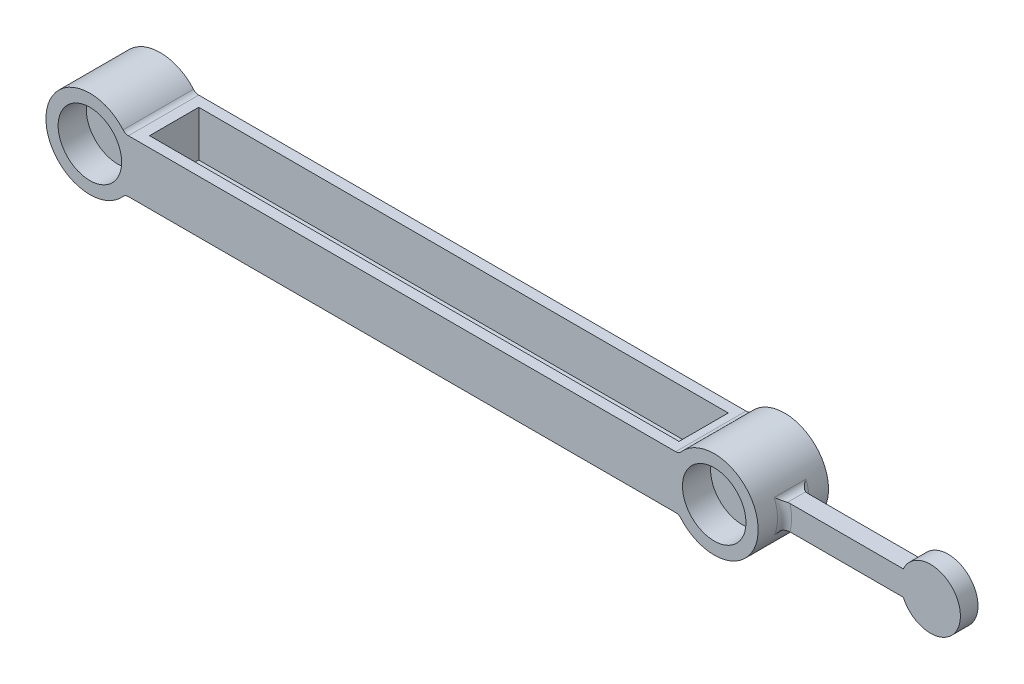
ISO-10303-21;
HEADER;
FILE_DESCRIPTION(('STEP AP214'),'2;1');
FILE_NAME('part.step','',(''),(''),'','','');
FILE_SCHEMA(('AUTOMOTIVE_DESIGN { 1 0 10303 214 1 1 1 1 }'));
ENDSEC;
DATA;
#1=APPLICATION_CONTEXT('core data for automotive mechanical design processes');
#2=APPLICATION_PROTOCOL_DEFINITION('international standard','automotive_design',2000,#1);
#3=PRODUCT_CONTEXT('',#1,'mechanical');
#4=PRODUCT('Part','Part','',(#3));
#5=PRODUCT_RELATED_PRODUCT_CATEGORY('part','',(#4));
#6=PRODUCT_DEFINITION_FORMATION('','',#4);
#7=PRODUCT_DEFINITION_CONTEXT('part definition',#1,'design');
#8=PRODUCT_DEFINITION('design','',#6,#7);
#9=PRODUCT_DEFINITION_SHAPE('','',#8);
#10=(LENGTH_UNIT() NAMED_UNIT(*) SI_UNIT(.MILLI.,.METRE.));
#11=(NAMED_UNIT(*) PLANE_ANGLE_UNIT() SI_UNIT($,.RADIAN.));
#12=(NAMED_UNIT(*) SI_UNIT($,.STERADIAN.) SOLID_ANGLE_UNIT());
#13=UNCERTAINTY_MEASURE_WITH_UNIT(LENGTH_MEASURE(1.E-05),#10,'distance_accuracy_value','');
#14=(GEOMETRIC_REPRESENTATION_CONTEXT(3) GLOBAL_UNCERTAINTY_ASSIGNED_CONTEXT((#13)) GLOBAL_UNIT_ASSIGNED_CONTEXT((#10,
#11,#12)) REPRESENTATION_CONTEXT('',''));
#15=CARTESIAN_POINT('',(0.,0.,0.));
#16=DIRECTION('',(0.,0.,1.));
#17=DIRECTION('',(1.,0.,0.));
#18=AXIS2_PLACEMENT_3D('',#15,#16,#17);
#19=CARTESIAN_POINT('',(187.5,-7.5,-35.3553390593273));
#20=DIRECTION('',(0.,0.,1.));
#21=DIRECTION('',(1.,0.,0.));
#22=AXIS2_PLACEMENT_3D('',#19,#20,#21);
#23=CYLINDRICAL_SURFACE('',#22,12.5);
#24=DIRECTION('',(0.,0.,1.));
#25=VECTOR('',#24,1.);
#26=CARTESIAN_POINT('',(178.056507629221,-15.6896551724138,-35.3553390593273));
#27=LINE('',#26,#25);
#28=CARTESIAN_POINT('',(178.056507629221,-15.6896551724138,20.));
#29=VERTEX_POINT('',#28);
#30=CARTESIAN_POINT('',(178.056507629221,-15.6896551724138,0.));
#31=VERTEX_POINT('',#30);
#32=EDGE_CURVE('E446',#29,#31,#27,.F.);
#33=ORIENTED_EDGE('',*,*,#32,.T.);
#34=CARTESIAN_POINT('',(187.5,-7.5,0.));
#35=DIRECTION('',(0.,0.,1.));
#36=DIRECTION('',(1.,0.,0.));
#37=AXIS2_PLACEMENT_3D('',#34,#35,#36);
#38=CIRCLE('',#37,12.5);
#39=CARTESIAN_POINT('',(178.056507629221,0.689655172413798,0.));
#40=VERTEX_POINT('',#39);
#41=EDGE_CURVE('E72',#40,#31,#38,.F.);
#42=ORIENTED_EDGE('',*,*,#41,.F.);
#43=DIRECTION('',(0.,0.,1.));
#44=VECTOR('',#43,1.);
#45=CARTESIAN_POINT('',(178.056507629221,0.689655172413793,-35.3553390593273));
#46=LINE('',#45,#44);
#47=CARTESIAN_POINT('',(178.056507629221,0.689655172413798,20.));
#48=VERTEX_POINT('',#47);
#49=EDGE_CURVE('E397',#40,#48,#46,.T.);
#50=ORIENTED_EDGE('',*,*,#49,.T.);
#51=CARTESIAN_POINT('',(187.5,-7.5,20.));
#52=DIRECTION('',(0.,0.,1.));
#53=DIRECTION('',(1.,0.,0.));
#54=AXIS2_PLACEMENT_3D('',#51,#52,#53);
#55=CIRCLE('',#54,12.5);
#56=EDGE_CURVE('E279',#29,#48,#55,.T.);
#57=ORIENTED_EDGE('',*,*,#56,.F.);
#58=EDGE_LOOP('',(#33,#42,#50,#57));
#59=FACE_BOUND('',#58,.T.);
#60=DIRECTION('',(0.,0.,1.));
#61=VECTOR('',#60,1.);
#62=CARTESIAN_POINT('',(199.065868849137,-2.75862068965515,-35.3553390593273));
#63=LINE('',#62,#61);
#64=CARTESIAN_POINT('',(199.065868849137,-2.75862068965515,14.5));
#65=VERTEX_POINT('',#64);
#66=CARTESIAN_POINT('',(199.065868849137,-2.75862068965515,5.5));
#67=VERTEX_POINT('',#66);
#68=EDGE_CURVE('E341',#65,#67,#63,.F.);
#69=ORIENTED_EDGE('',*,*,#68,.T.);
#70=CARTESIAN_POINT('',(187.5,-7.5,5.50000000000001));
#71=DIRECTION('',(0.,0.,-1.));
#72=DIRECTION('',(-1.,0.,0.));
#73=AXIS2_PLACEMENT_3D('',#70,#71,#72);
#74=CIRCLE('',#73,12.5);
#75=CARTESIAN_POINT('',(199.163765639202,-11.99517197822,5.49999999999999));
#76=VERTEX_POINT('',#75);
#77=EDGE_CURVE('E344',#67,#76,#74,.T.);
#78=ORIENTED_EDGE('',*,*,#77,.T.);
#79=DIRECTION('',(0.,0.,1.));
#80=VECTOR('',#79,1.);
#81=CARTESIAN_POINT('',(199.163765639202,-11.99517197822,-35.3553390593273));
#82=LINE('',#81,#80);
#83=CARTESIAN_POINT('',(199.163765639202,-11.99517197822,14.5));
#84=VERTEX_POINT('',#83);
#85=EDGE_CURVE('E335',#76,#84,#82,.T.);
#86=ORIENTED_EDGE('',*,*,#85,.T.);
#87=CARTESIAN_POINT('',(187.5,-7.5,14.5));
#88=DIRECTION('',(0.,0.,1.));
#89=DIRECTION('',(1.,0.,0.));
#90=AXIS2_PLACEMENT_3D('',#87,#88,#89);
#91=CIRCLE('',#90,12.5);
#92=EDGE_CURVE('E338',#84,#65,#91,.T.);
#93=ORIENTED_EDGE('',*,*,#92,.T.);
#94=EDGE_LOOP('',(#69,#78,#86,#93));
#95=FACE_BOUND('',#94,.T.);
#96=ADVANCED_FACE('F48',(#59,#95),#23,.T.);
#97=CARTESIAN_POINT('',(176.545548849897,2.,-35.3553390593273));
#98=DIRECTION('',(0.,0.,1.));
#99=DIRECTION('',(1.,0.,0.));
#100=AXIS2_PLACEMENT_3D('',#97,#98,#99);
#101=CYLINDRICAL_SURFACE('',#100,2.);
#102=CARTESIAN_POINT('',(176.545548849897,2.,0.));
#103=DIRECTION('',(0.,0.,1.));
#104=DIRECTION('',(1.,0.,0.));
#105=AXIS2_PLACEMENT_3D('',#102,#103,#104);
#106=CIRCLE('',#105,2.);
#107=CARTESIAN_POINT('',(176.545548849897,0.,0.));
#108=VERTEX_POINT('',#107);
#109=EDGE_CURVE('E440',#108,#40,#106,.T.);
#110=ORIENTED_EDGE('',*,*,#109,.F.);
#111=DIRECTION('',(0.,0.,-1.));
#112=VECTOR('',#111,1.);
#113=CARTESIAN_POINT('',(176.545548849897,0.,0.));
#114=LINE('',#113,#112);
#115=CARTESIAN_POINT('',(176.545548849897,0.,20.));
#116=VERTEX_POINT('',#115);
#117=EDGE_CURVE('E434',#116,#108,#114,.T.);
#118=ORIENTED_EDGE('',*,*,#117,.F.);
#119=CARTESIAN_POINT('',(176.545548849897,2.,20.));
#120=DIRECTION('',(0.,0.,1.));
#121=DIRECTION('',(1.,0.,0.));
#122=AXIS2_PLACEMENT_3D('',#119,#120,#121);
#123=CIRCLE('',#122,2.);
#124=EDGE_CURVE('E437',#48,#116,#123,.F.);
#125=ORIENTED_EDGE('',*,*,#124,.F.);
#126=ORIENTED_EDGE('',*,*,#49,.F.);
#127=EDGE_LOOP('',(#110,#118,#125,#126));
#128=FACE_BOUND('',#127,.T.);
#129=ADVANCED_FACE('F414',(#128),#101,.F.);
#130=CARTESIAN_POINT('',(187.5,-7.5,-29.));
#131=DIRECTION('',(0.,0.,1.));
#132=DIRECTION('',(1.,0.,0.));
#133=AXIS2_PLACEMENT_3D('',#130,#131,#132);
#134=CYLINDRICAL_SURFACE('',#133,9.025);
#135=CARTESIAN_POINT('',(187.5,-7.5,20.));
#136=DIRECTION('',(0.,0.,1.));
#137=DIRECTION('',(1.,0.,0.));
#138=AXIS2_PLACEMENT_3D('',#135,#136,#137);
#139=CIRCLE('',#138,9.025);
#140=CARTESIAN_POINT('',(196.525,-7.5,20.));
#141=VERTEX_POINT('',#140);
#142=EDGE_CURVE('E462',#141,#141,#139,.T.);
#143=ORIENTED_EDGE('',*,*,#142,.T.);
#144=EDGE_LOOP('',(#143));
#145=FACE_BOUND('',#144,.T.);
#146=CARTESIAN_POINT('',(187.5,-7.5,12.));
#147=DIRECTION('',(0.,0.,-1.));
#148=DIRECTION('',(-1.,0.,0.));
#149=AXIS2_PLACEMENT_3D('',#146,#147,#148);
#150=CIRCLE('',#149,9.025);
#151=CARTESIAN_POINT('',(178.475,-7.5,12.));
#152=VERTEX_POINT('',#151);
#153=EDGE_CURVE('E57',#152,#152,#150,.F.);
#154=ORIENTED_EDGE('',*,*,#153,.F.);
#155=EDGE_LOOP('',(#154));
#156=FACE_BOUND('',#155,.T.);
#157=ADVANCED_FACE('F475',(#145,#156),#134,.F.);
#158=CARTESIAN_POINT('',(187.5,-7.5,0.));
#159=DIRECTION('',(0.,0.,1.));
#160=DIRECTION('',(1.,0.,0.));
#161=AXIS2_PLACEMENT_3D('',#158,#159,#160);
#162=CIRCLE('',#161,9.025);
#163=CARTESIAN_POINT('',(196.525,-7.5,0.));
#164=VERTEX_POINT('',#163);
#165=EDGE_CURVE('E458',#164,#164,#162,.T.);
#166=ORIENTED_EDGE('',*,*,#165,.F.);
#167=EDGE_LOOP('',(#166));
#168=FACE_BOUND('',#167,.T.);
#169=CARTESIAN_POINT('',(187.5,-7.5,8.));
#170=DIRECTION('',(0.,0.,1.));
#171=DIRECTION('',(1.,0.,0.));
#172=AXIS2_PLACEMENT_3D('',#169,#170,#171);
#173=CIRCLE('',#172,9.025);
#174=CARTESIAN_POINT('',(196.525,-7.5,8.));
#175=VERTEX_POINT('',#174);
#176=EDGE_CURVE('E12',#175,#175,#173,.F.);
#177=ORIENTED_EDGE('',*,*,#176,.F.);
#178=EDGE_LOOP('',(#177));
#179=FACE_BOUND('',#178,.T.);
#180=ADVANCED_FACE('F477',(#168,#179),#134,.F.);
#181=CARTESIAN_POINT('',(10.,-7.5,20.));
#182=DIRECTION('',(0.,0.,-1.));
#183=DIRECTION('',(-1.,0.,0.));
#184=AXIS2_PLACEMENT_3D('',#181,#182,#183);
#185=CYLINDRICAL_SURFACE('',#184,12.5);
#186=DIRECTION('',(0.,0.,-1.));
#187=VECTOR('',#186,1.);
#188=CARTESIAN_POINT('',(19.4434923707787,0.689655172413792,20.));
#189=LINE('',#188,#187);
#190=CARTESIAN_POINT('',(19.4434923707787,0.689655172413794,20.));
#191=VERTEX_POINT('',#190);
#192=CARTESIAN_POINT('',(19.4434923707787,0.689655172413794,0.));
#193=VERTEX_POINT('',#192);
#194=EDGE_CURVE('E317',#191,#193,#189,.T.);
#195=ORIENTED_EDGE('',*,*,#194,.T.);
#196=CARTESIAN_POINT('',(10.,-7.5,0.));
#197=DIRECTION('',(0.,0.,-1.));
#198=DIRECTION('',(-1.,0.,0.));
#199=AXIS2_PLACEMENT_3D('',#196,#197,#198);
#200=CIRCLE('',#199,12.5);
#201=CARTESIAN_POINT('',(19.4434923707787,-15.6896551724138,0.));
#202=VERTEX_POINT('',#201);
#203=EDGE_CURVE('E284',#202,#193,#200,.T.);
#204=ORIENTED_EDGE('',*,*,#203,.F.);
#205=DIRECTION('',(0.,0.,-1.));
#206=VECTOR('',#205,1.);
#207=CARTESIAN_POINT('',(19.4434923707787,-15.6896551724138,20.));
#208=LINE('',#207,#206);
#209=CARTESIAN_POINT('',(19.4434923707787,-15.6896551724138,20.));
#210=VERTEX_POINT('',#209);
#211=EDGE_CURVE('E308',#202,#210,#208,.F.);
#212=ORIENTED_EDGE('',*,*,#211,.T.);
#213=CARTESIAN_POINT('',(10.,-7.5,20.));
#214=DIRECTION('',(0.,0.,-1.));
#215=DIRECTION('',(-1.,0.,0.));
#216=AXIS2_PLACEMENT_3D('',#213,#214,#215);
#217=CIRCLE('',#216,12.5);
#218=EDGE_CURVE('E285',#210,#191,#217,.T.);
#219=ORIENTED_EDGE('',*,*,#218,.T.);
#220=EDGE_LOOP('',(#195,#204,#212,#219));
#221=FACE_BOUND('',#220,.T.);
#222=ADVANCED_FACE('F484',(#221),#185,.T.);
#223=CARTESIAN_POINT('',(20.9544511501033,2.,20.));
#224=DIRECTION('',(0.,0.,-1.));
#225=DIRECTION('',(-1.,0.,0.));
#226=AXIS2_PLACEMENT_3D('',#223,#224,#225);
#227=CYLINDRICAL_SURFACE('',#226,2.);
#228=CARTESIAN_POINT('',(20.9544511501033,2.,20.));
#229=DIRECTION('',(0.,0.,1.));
#230=DIRECTION('',(1.,0.,0.));
#231=AXIS2_PLACEMENT_3D('',#228,#229,#230);
#232=CIRCLE('',#231,2.);
#233=CARTESIAN_POINT('',(20.9544511501033,0.,20.));
#234=VERTEX_POINT('',#233);
#235=EDGE_CURVE('E327',#234,#191,#232,.F.);
#236=ORIENTED_EDGE('',*,*,#235,.F.);
#237=DIRECTION('',(0.,0.,1.));
#238=VECTOR('',#237,1.);
#239=CARTESIAN_POINT('',(20.9544511501033,0.,20.));
#240=LINE('',#239,#238);
#241=CARTESIAN_POINT('',(20.9544511501033,0.,0.));
#242=VERTEX_POINT('',#241);
#243=EDGE_CURVE('E321',#242,#234,#240,.T.);
#244=ORIENTED_EDGE('',*,*,#243,.F.);
#245=CARTESIAN_POINT('',(20.9544511501033,2.,0.));
#246=DIRECTION('',(0.,0.,1.));
#247=DIRECTION('',(1.,0.,0.));
#248=AXIS2_PLACEMENT_3D('',#245,#246,#247);
#249=CIRCLE('',#248,2.);
#250=EDGE_CURVE('E324',#193,#242,#249,.T.);
#251=ORIENTED_EDGE('',*,*,#250,.F.);
#252=ORIENTED_EDGE('',*,*,#194,.F.);
#253=EDGE_LOOP('',(#236,#244,#251,#252));
#254=FACE_BOUND('',#253,.T.);
#255=ADVANCED_FACE('F502',(#254),#227,.F.);
#256=CARTESIAN_POINT('',(176.545548849897,-17.,-35.3553390593273));
#257=DIRECTION('',(0.,0.,1.));
#258=DIRECTION('',(1.,0.,0.));
#259=AXIS2_PLACEMENT_3D('',#256,#257,#258);
#260=CYLINDRICAL_SURFACE('',#259,2.);
#261=CARTESIAN_POINT('',(176.545548849897,-17.,20.));
#262=DIRECTION('',(0.,0.,1.));
#263=DIRECTION('',(1.,0.,0.));
#264=AXIS2_PLACEMENT_3D('',#261,#262,#263);
#265=CIRCLE('',#264,2.);
#266=CARTESIAN_POINT('',(176.545548849897,-15.,20.));
#267=VERTEX_POINT('',#266);
#268=EDGE_CURVE('E64',#267,#29,#265,.F.);
#269=ORIENTED_EDGE('',*,*,#268,.F.);
#270=DIRECTION('',(0.,0.,1.));
#271=VECTOR('',#270,1.);
#272=CARTESIAN_POINT('',(176.545548849897,-15.,20.));
#273=LINE('',#272,#271);
#274=CARTESIAN_POINT('',(176.545548849897,-15.,0.));
#275=VERTEX_POINT('',#274);
#276=EDGE_CURVE('E443',#275,#267,#273,.T.);
#277=ORIENTED_EDGE('',*,*,#276,.F.);
#278=CARTESIAN_POINT('',(176.545548849897,-17.,0.));
#279=DIRECTION('',(0.,0.,1.));
#280=DIRECTION('',(1.,0.,0.));
#281=AXIS2_PLACEMENT_3D('',#278,#279,#280);
#282=CIRCLE('',#281,2.);
#283=EDGE_CURVE('E451',#31,#275,#282,.T.);
#284=ORIENTED_EDGE('',*,*,#283,.F.);
#285=ORIENTED_EDGE('',*,*,#32,.F.);
#286=EDGE_LOOP('',(#269,#277,#284,#285));
#287=FACE_BOUND('',#286,.T.);
#288=ADVANCED_FACE('F50',(#287),#260,.F.);
#289=CARTESIAN_POINT('',(20.9544511501033,-17.,20.));
#290=DIRECTION('',(0.,0.,-1.));
#291=DIRECTION('',(-1.,0.,0.));
#292=AXIS2_PLACEMENT_3D('',#289,#290,#291);
#293=CYLINDRICAL_SURFACE('',#292,2.);
#294=CARTESIAN_POINT('',(20.9544511501033,-17.,20.));
#295=DIRECTION('',(0.,0.,1.));
#296=DIRECTION('',(1.,0.,0.));
#297=AXIS2_PLACEMENT_3D('',#294,#295,#296);
#298=CIRCLE('',#297,2.);
#299=CARTESIAN_POINT('',(20.9544511501033,-15.,20.));
#300=VERTEX_POINT('',#299);
#301=EDGE_CURVE('E314',#210,#300,#298,.F.);
#302=ORIENTED_EDGE('',*,*,#301,.F.);
#303=ORIENTED_EDGE('',*,*,#211,.F.);
#304=CARTESIAN_POINT('',(20.9544511501033,-17.,0.));
#305=DIRECTION('',(0.,0.,1.));
#306=DIRECTION('',(1.,0.,0.));
#307=AXIS2_PLACEMENT_3D('',#304,#305,#306);
#308=CIRCLE('',#307,2.);
#309=CARTESIAN_POINT('',(20.9544511501033,-15.,0.));
#310=VERTEX_POINT('',#309);
#311=EDGE_CURVE('E311',#310,#202,#308,.T.);
#312=ORIENTED_EDGE('',*,*,#311,.F.);
#313=DIRECTION('',(0.,0.,-1.));
#314=VECTOR('',#313,1.);
#315=CARTESIAN_POINT('',(20.9544511501033,-15.,20.));
#316=LINE('',#315,#314);
#317=EDGE_CURVE('E299',#300,#310,#316,.T.);
#318=ORIENTED_EDGE('',*,*,#317,.F.);
#319=EDGE_LOOP('',(#302,#303,#312,#318));
#320=FACE_BOUND('',#319,.T.);
#321=ADVANCED_FACE('F519',(#320),#293,.F.);
#322=CARTESIAN_POINT('',(10.,-7.5,-29.));
#323=DIRECTION('',(0.,0.,1.));
#324=DIRECTION('',(1.,0.,0.));
#325=AXIS2_PLACEMENT_3D('',#322,#323,#324);
#326=CYLINDRICAL_SURFACE('',#325,9.025);
#327=CARTESIAN_POINT('',(10.,-7.5,0.));
#328=DIRECTION('',(0.,0.,1.));
#329=DIRECTION('',(1.,0.,0.));
#330=AXIS2_PLACEMENT_3D('',#327,#328,#329);
#331=CIRCLE('',#330,9.025);
#332=CARTESIAN_POINT('',(19.025,-7.5,0.));
#333=VERTEX_POINT('',#332);
#334=EDGE_CURVE('E232',#333,#333,#331,.T.);
#335=ORIENTED_EDGE('',*,*,#334,.F.);
#336=EDGE_LOOP('',(#335));
#337=FACE_BOUND('',#336,.T.);
#338=CARTESIAN_POINT('',(10.,-7.5,8.));
#339=DIRECTION('',(0.,0.,1.));
#340=DIRECTION('',(1.,0.,0.));
#341=AXIS2_PLACEMENT_3D('',#338,#339,#340);
#342=CIRCLE('',#341,9.025);
#343=CARTESIAN_POINT('',(19.025,-7.5,8.));
#344=VERTEX_POINT('',#343);
#345=EDGE_CURVE('E466',#344,#344,#342,.F.);
#346=ORIENTED_EDGE('',*,*,#345,.F.);
#347=EDGE_LOOP('',(#346));
#348=FACE_BOUND('',#347,.T.);
#349=ADVANCED_FACE('F522',(#337,#348),#326,.F.);
#350=CARTESIAN_POINT('',(10.,-7.5,20.));
#351=DIRECTION('',(0.,0.,1.));
#352=DIRECTION('',(1.,0.,0.));
#353=AXIS2_PLACEMENT_3D('',#350,#351,#352);
#354=CIRCLE('',#353,9.025);
#355=CARTESIAN_POINT('',(19.025,-7.5,20.));
#356=VERTEX_POINT('',#355);
#357=EDGE_CURVE('E222',#356,#356,#354,.T.);
#358=ORIENTED_EDGE('',*,*,#357,.T.);
#359=EDGE_LOOP('',(#358));
#360=FACE_BOUND('',#359,.T.);
#361=CARTESIAN_POINT('',(10.,-7.5,12.));
#362=DIRECTION('',(0.,0.,-1.));
#363=DIRECTION('',(-1.,0.,0.));
#364=AXIS2_PLACEMENT_3D('',#361,#362,#363);
#365=CIRCLE('',#364,9.025);
#366=CARTESIAN_POINT('',(0.974999999999997,-7.5,12.));
#367=VERTEX_POINT('',#366);
#368=EDGE_CURVE('E454',#367,#367,#365,.F.);
#369=ORIENTED_EDGE('',*,*,#368,.F.);
#370=EDGE_LOOP('',(#369));
#371=FACE_BOUND('',#370,.T.);
#372=ADVANCED_FACE('F575',(#360,#371),#326,.F.);
#373=CARTESIAN_POINT('',(200.,-20.001,12.5));
#374=DIRECTION('',(0.,0.,1.));
#375=DIRECTION('',(1.,0.,0.));
#376=AXIS2_PLACEMENT_3D('',#373,#374,#375);
#377=PLANE('',#376);
#378=CARTESIAN_POINT('',(241.5,-7.49999999999998,12.5));
#379=DIRECTION('',(0.,0.,1.));
#380=DIRECTION('',(1.,0.,0.));
#381=AXIS2_PLACEMENT_3D('',#378,#379,#380);
#382=CIRCLE('',#381,8.50000000000001);
#383=CARTESIAN_POINT('',(233.754033307585,-3.99999999999998,12.5));
#384=VERTEX_POINT('',#383);
#385=CARTESIAN_POINT('',(233.754033307585,-11.,12.5));
#386=VERTEX_POINT('',#385);
#387=EDGE_CURVE('E250',#384,#386,#382,.F.);
#388=ORIENTED_EDGE('',*,*,#387,.F.);
#389=DIRECTION('',(1.,0.,0.));
#390=VECTOR('',#389,1.);
#391=CARTESIAN_POINT('',(200.,-3.99999999999998,12.5));
#392=LINE('',#391,#390);
#393=CARTESIAN_POINT('',(201.57124727947,-3.99999999999998,12.5));
#394=VERTEX_POINT('',#393);
#395=EDGE_CURVE('E272',#394,#384,#392,.T.);
#396=ORIENTED_EDGE('',*,*,#395,.F.);
#397=CARTESIAN_POINT('',(187.5,-7.5,12.5));
#398=DIRECTION('',(0.,0.,1.));
#399=DIRECTION('',(1.,0.,0.));
#400=AXIS2_PLACEMENT_3D('',#397,#398,#399);
#401=CIRCLE('',#400,14.5);
#402=CARTESIAN_POINT('',(201.57124727947,-11.,12.5));
#403=VERTEX_POINT('',#402);
#404=EDGE_CURVE('E351',#394,#403,#401,.F.);
#405=ORIENTED_EDGE('',*,*,#404,.T.);
#406=DIRECTION('',(-1.,0.,0.));
#407=VECTOR('',#406,1.);
#408=CARTESIAN_POINT('',(250.,-11.,12.5));
#409=LINE('',#408,#407);
#410=EDGE_CURVE('E269',#386,#403,#409,.T.);
#411=ORIENTED_EDGE('',*,*,#410,.F.);
#412=EDGE_LOOP('',(#388,#396,#405,#411));
#413=FACE_BOUND('',#412,.T.);
#414=ADVANCED_FACE('F385',(#413),#377,.T.);
#415=CARTESIAN_POINT('',(200.,-20.001,7.50000000000001));
#416=DIRECTION('',(0.,0.,-1.));
#417=DIRECTION('',(-1.,0.,0.));
#418=AXIS2_PLACEMENT_3D('',#415,#416,#417);
#419=PLANE('',#418);
#420=DIRECTION('',(-1.,0.,0.));
#421=VECTOR('',#420,1.);
#422=CARTESIAN_POINT('',(200.,-3.99999999999998,7.50000000000001));
#423=LINE('',#422,#421);
#424=CARTESIAN_POINT('',(233.754033307585,-3.99999999999998,7.50000000000001));
#425=VERTEX_POINT('',#424);
#426=CARTESIAN_POINT('',(201.57124727947,-3.99999999999998,7.50000000000001));
#427=VERTEX_POINT('',#426);
#428=EDGE_CURVE('E276',#425,#427,#423,.T.);
#429=ORIENTED_EDGE('',*,*,#428,.F.);
#430=CARTESIAN_POINT('',(241.5,-7.49999999999998,7.50000000000001));
#431=DIRECTION('',(0.,0.,-1.));
#432=DIRECTION('',(-1.,0.,0.));
#433=AXIS2_PLACEMENT_3D('',#430,#431,#432);
#434=CIRCLE('',#433,8.50000000000001);
#435=CARTESIAN_POINT('',(233.754033307585,-11.,7.50000000000001));
#436=VERTEX_POINT('',#435);
#437=EDGE_CURVE('E241',#425,#436,#434,.T.);
#438=ORIENTED_EDGE('',*,*,#437,.T.);
#439=DIRECTION('',(-1.,0.,0.));
#440=VECTOR('',#439,1.);
#441=CARTESIAN_POINT('',(250.,-11.,7.5));
#442=LINE('',#441,#440);
#443=CARTESIAN_POINT('',(201.57124727947,-11.,7.5));
#444=VERTEX_POINT('',#443);
#445=EDGE_CURVE('E265',#436,#444,#442,.T.);
#446=ORIENTED_EDGE('',*,*,#445,.T.);
#447=CARTESIAN_POINT('',(187.5,-7.5,7.50000000000001));
#448=DIRECTION('',(0.,0.,-1.));
#449=DIRECTION('',(-1.,0.,0.));
#450=AXIS2_PLACEMENT_3D('',#447,#448,#449);
#451=CIRCLE('',#450,14.5);
#452=EDGE_CURVE('E331',#444,#427,#451,.F.);
#453=ORIENTED_EDGE('',*,*,#452,.T.);
#454=EDGE_LOOP('',(#429,#438,#446,#453));
#455=FACE_BOUND('',#454,.T.);
#456=ADVANCED_FACE('F499',(#455),#419,.T.);
#457=CARTESIAN_POINT('',(0.,0.,20.));
#458=DIRECTION('',(0.,0.,1.));
#459=DIRECTION('',(1.,0.,0.));
#460=AXIS2_PLACEMENT_3D('',#457,#458,#459);
#461=PLANE('',#460);
#462=ORIENTED_EDGE('',*,*,#142,.F.);
#463=EDGE_LOOP('',(#462));
#464=FACE_BOUND('',#463,.T.);
#465=ORIENTED_EDGE('',*,*,#357,.F.);
#466=EDGE_LOOP('',(#465));
#467=FACE_BOUND('',#466,.T.);
#468=DIRECTION('',(1.,0.,0.));
#469=VECTOR('',#468,1.);
#470=CARTESIAN_POINT('',(0.,-15.,20.));
#471=LINE('',#470,#469);
#472=EDGE_CURVE('E291',#300,#267,#471,.T.);
#473=ORIENTED_EDGE('',*,*,#472,.T.);
#474=ORIENTED_EDGE('',*,*,#268,.T.);
#475=ORIENTED_EDGE('',*,*,#56,.T.);
#476=ORIENTED_EDGE('',*,*,#124,.T.);
#477=DIRECTION('',(1.,0.,0.));
#478=VECTOR('',#477,1.);
#479=CARTESIAN_POINT('',(0.,0.,20.));
#480=LINE('',#479,#478);
#481=EDGE_CURVE('E294',#234,#116,#480,.T.);
#482=ORIENTED_EDGE('',*,*,#481,.F.);
#483=ORIENTED_EDGE('',*,*,#235,.T.);
#484=ORIENTED_EDGE('',*,*,#218,.F.);
#485=ORIENTED_EDGE('',*,*,#301,.T.);
#486=EDGE_LOOP('',(#473,#474,#475,#476,#482,#483,#484,#485));
#487=FACE_BOUND('',#486,.T.);
#488=ADVANCED_FACE('F504',(#464,#467,#487),#461,.T.);
#489=CARTESIAN_POINT('',(0.,0.,0.));
#490=DIRECTION('',(0.,0.,1.));
#491=DIRECTION('',(1.,0.,0.));
#492=AXIS2_PLACEMENT_3D('',#489,#490,#491);
#493=PLANE('',#492);
#494=ORIENTED_EDGE('',*,*,#165,.T.);
#495=EDGE_LOOP('',(#494));
#496=FACE_BOUND('',#495,.T.);
#497=ORIENTED_EDGE('',*,*,#334,.T.);
#498=EDGE_LOOP('',(#497));
#499=FACE_BOUND('',#498,.T.);
#500=DIRECTION('',(1.,0.,0.));
#501=VECTOR('',#500,1.);
#502=CARTESIAN_POINT('',(0.,0.,0.));
#503=LINE('',#502,#501);
#504=EDGE_CURVE('E295',#242,#108,#503,.T.);
#505=ORIENTED_EDGE('',*,*,#504,.T.);
#506=ORIENTED_EDGE('',*,*,#109,.T.);
#507=ORIENTED_EDGE('',*,*,#41,.T.);
#508=ORIENTED_EDGE('',*,*,#283,.T.);
#509=DIRECTION('',(1.,0.,0.));
#510=VECTOR('',#509,1.);
#511=CARTESIAN_POINT('',(0.,-15.,0.));
#512=LINE('',#511,#510);
#513=EDGE_CURVE('E288',#310,#275,#512,.T.);
#514=ORIENTED_EDGE('',*,*,#513,.F.);
#515=ORIENTED_EDGE('',*,*,#311,.T.);
#516=ORIENTED_EDGE('',*,*,#203,.T.);
#517=ORIENTED_EDGE('',*,*,#250,.T.);
#518=EDGE_LOOP('',(#505,#506,#507,#508,#514,#515,#516,#517));
#519=FACE_BOUND('',#518,.T.);
#520=ADVANCED_FACE('F507',(#496,#499,#519),#493,.F.);
#521=CARTESIAN_POINT('',(0.,-15.,20.));
#522=DIRECTION('',(0.,1.,0.));
#523=DIRECTION('',(0.,0.,1.));
#524=AXIS2_PLACEMENT_3D('',#521,#522,#523);
#525=PLANE('',#524);
#526=ORIENTED_EDGE('',*,*,#513,.T.);
#527=ORIENTED_EDGE('',*,*,#276,.T.);
#528=ORIENTED_EDGE('',*,*,#472,.F.);
#529=ORIENTED_EDGE('',*,*,#317,.T.);
#530=EDGE_LOOP('',(#526,#527,#528,#529));
#531=FACE_BOUND('',#530,.T.);
#532=ADVANCED_FACE('F511',(#531),#525,.F.);
#533=CARTESIAN_POINT('',(0.,0.,20.));
#534=DIRECTION('',(0.,1.,0.));
#535=DIRECTION('',(0.,0.,1.));
#536=AXIS2_PLACEMENT_3D('',#533,#534,#535);
#537=PLANE('',#536);
#538=DIRECTION('',(0.,0.,1.));
#539=VECTOR('',#538,1.);
#540=CARTESIAN_POINT('',(23.9544511501033,0.,3.));
#541=LINE('',#540,#539);
#542=CARTESIAN_POINT('',(23.9544511501033,0.,3.));
#543=VERTEX_POINT('',#542);
#544=CARTESIAN_POINT('',(23.9544511501033,0.,17.));
#545=VERTEX_POINT('',#544);
#546=EDGE_CURVE('E195',#543,#545,#541,.T.);
#547=ORIENTED_EDGE('',*,*,#546,.F.);
#548=DIRECTION('',(-1.,0.,0.));
#549=VECTOR('',#548,1.);
#550=CARTESIAN_POINT('',(23.9544511501033,0.,3.));
#551=LINE('',#550,#549);
#552=CARTESIAN_POINT('',(174.5,0.,3.));
#553=VERTEX_POINT('',#552);
#554=EDGE_CURVE('E215',#553,#543,#551,.T.);
#555=ORIENTED_EDGE('',*,*,#554,.F.);
#556=DIRECTION('',(0.,0.,-1.));
#557=VECTOR('',#556,1.);
#558=CARTESIAN_POINT('',(174.5,0.,3.));
#559=LINE('',#558,#557);
#560=CARTESIAN_POINT('',(174.5,0.,17.));
#561=VERTEX_POINT('',#560);
#562=EDGE_CURVE('E219',#561,#553,#559,.T.);
#563=ORIENTED_EDGE('',*,*,#562,.F.);
#564=DIRECTION('',(1.,0.,0.));
#565=VECTOR('',#564,1.);
#566=CARTESIAN_POINT('',(23.9544511501033,0.,17.));
#567=LINE('',#566,#565);
#568=EDGE_CURVE('E231',#545,#561,#567,.T.);
#569=ORIENTED_EDGE('',*,*,#568,.F.);
#570=EDGE_LOOP('',(#547,#555,#563,#569));
#571=FACE_BOUND('',#570,.T.);
#572=ORIENTED_EDGE('',*,*,#481,.T.);
#573=ORIENTED_EDGE('',*,*,#117,.T.);
#574=ORIENTED_EDGE('',*,*,#504,.F.);
#575=ORIENTED_EDGE('',*,*,#243,.T.);
#576=EDGE_LOOP('',(#572,#573,#574,#575));
#577=FACE_BOUND('',#576,.T.);
#578=ADVANCED_FACE('F381',(#571,#577),#537,.T.);
#579=CARTESIAN_POINT('',(0.,-3.99999999999998,0.));
#580=DIRECTION('',(0.,1.,0.));
#581=DIRECTION('',(0.,0.,1.));
#582=AXIS2_PLACEMENT_3D('',#579,#580,#581);
#583=PLANE('',#582);
#584=DIRECTION('',(0.,0.,-1.));
#585=VECTOR('',#584,1.);
#586=CARTESIAN_POINT('',(233.754033307585,-3.99999999999998,36.5416305603426));
#587=LINE('',#586,#585);
#588=EDGE_CURVE('E257',#425,#384,#587,.F.);
#589=ORIENTED_EDGE('',*,*,#588,.F.);
#590=ORIENTED_EDGE('',*,*,#428,.T.);
#591=CARTESIAN_POINT('',(201.57124727947,-3.99999999999998,7.50000000000001));
#592=CARTESIAN_POINT('',(201.515605478267,-3.99999999999998,7.50000359986055));
#593=CARTESIAN_POINT('',(201.459964742336,-3.99999999999998,7.49781329007921));
#594=CARTESIAN_POINT('',(201.349363147591,-3.99999999999998,7.48910786881818));
#595=CARTESIAN_POINT('',(201.294400211957,-3.99999999999998,7.48261913950181));
#596=CARTESIAN_POINT('',(201.185147898397,-3.99999999999998,7.46537904372189));
#597=CARTESIAN_POINT('',(201.130858508989,-3.99999999999998,7.45462775002152));
#598=CARTESIAN_POINT('',(201.022952882588,-3.99999999999998,7.42885085870193));
#599=CARTESIAN_POINT('',(200.969342796758,-3.99999999999998,7.41379951092649));
#600=CARTESIAN_POINT('',(200.916407864999,-3.99999999999998,7.39665866512649));
#601=B_SPLINE_CURVE_WITH_KNOTS('',3,(#591,#592,#593,#594,#595,#596,#597,#598,#599,#600),
.UNSPECIFIED.,.F.,.F.,(4,2,2,2,4),(0.,0.166880700383961,0.332746520621892,0.498609509604915,
0.665487343841117),.UNSPECIFIED.);
#602=CARTESIAN_POINT('',(200.916407864999,-3.99999999999998,7.39665866512649));
#603=VERTEX_POINT('',#602);
#604=EDGE_CURVE('E355',#427,#603,#601,.T.);
#605=ORIENTED_EDGE('',*,*,#604,.T.);
#606=DIRECTION('',(0.,0.,-1.));
#607=VECTOR('',#606,1.);
#608=CARTESIAN_POINT('',(200.916407864999,-3.99999999999998,12.5));
#609=LINE('',#608,#607);
#610=CARTESIAN_POINT('',(200.916407864999,-3.99999999999998,12.6033413348735));
#611=VERTEX_POINT('',#610);
#612=EDGE_CURVE('E348',#603,#611,#609,.F.);
#613=ORIENTED_EDGE('',*,*,#612,.T.);
#614=CARTESIAN_POINT('',(200.916407864999,-3.99999999999998,12.6033413348735));
#615=CARTESIAN_POINT('',(200.969342796758,-3.99999999999998,12.5862004890735));
#616=CARTESIAN_POINT('',(201.022952882588,-3.99999999999998,12.5711491412981));
#617=CARTESIAN_POINT('',(201.130858508989,-3.99999999999998,12.5453722499785));
#618=CARTESIAN_POINT('',(201.185147898397,-3.99999999999998,12.5346209562781));
#619=CARTESIAN_POINT('',(201.294400211957,-3.99999999999998,12.5173808604982));
#620=CARTESIAN_POINT('',(201.349363147591,-3.99999999999998,12.5108921311818));
#621=CARTESIAN_POINT('',(201.459964742336,-3.99999999999998,12.5021867099208));
#622=CARTESIAN_POINT('',(201.515605478267,-3.99999999999998,12.4999964001395));
#623=CARTESIAN_POINT('',(201.57124727947,-3.99999999999998,12.5));
#624=B_SPLINE_CURVE_WITH_KNOTS('',3,(#614,#615,#616,#617,#618,#619,#620,#621,#622,#623),
.UNSPECIFIED.,.F.,.F.,(4,2,2,2,4),(0.,0.166877834236202,0.332740823219225,0.498606643457156,
0.665487343841117),.UNSPECIFIED.);
#625=EDGE_CURVE('E389',#611,#394,#624,.T.);
#626=ORIENTED_EDGE('',*,*,#625,.T.);
#627=ORIENTED_EDGE('',*,*,#395,.T.);
#628=EDGE_LOOP('',(#589,#590,#605,#613,#626,#627));
#629=FACE_BOUND('',#628,.T.);
#630=ADVANCED_FACE('F376',(#629),#583,.T.);
#631=CARTESIAN_POINT('',(250.,-11.,12.5));
#632=DIRECTION('',(0.,1.,0.));
#633=DIRECTION('',(-1.,0.,0.));
#634=AXIS2_PLACEMENT_3D('',#631,#632,#633);
#635=PLANE('',#634);
#636=ORIENTED_EDGE('',*,*,#445,.F.);
#637=DIRECTION('',(0.,0.,-1.));
#638=VECTOR('',#637,1.);
#639=CARTESIAN_POINT('',(233.754033307585,-11.,36.5416305603426));
#640=LINE('',#639,#638);
#641=EDGE_CURVE('E253',#436,#386,#640,.F.);
#642=ORIENTED_EDGE('',*,*,#641,.T.);
#643=ORIENTED_EDGE('',*,*,#410,.T.);
#644=CARTESIAN_POINT('',(201.57124727947,-11.,12.5));
#645=CARTESIAN_POINT('',(201.51162382029,-11.,12.5000016456297));
#646=CARTESIAN_POINT('',(201.452029989283,-11.,12.5025124577496));
#647=CARTESIAN_POINT('',(201.333262944996,-11.,12.512524431705));
#648=CARTESIAN_POINT('',(201.274089732418,-11.,12.5200256018678));
#649=CARTESIAN_POINT('',(201.097716265368,-11.,12.5499772638655));
#650=CARTESIAN_POINT('',(200.981690002942,-11.,12.5798758811724));
#651=CARTESIAN_POINT('',(200.756284563965,-11.,12.6587515729556));
#652=CARTESIAN_POINT('',(200.646910918206,-11.,12.7077442776903));
#653=CARTESIAN_POINT('',(200.438199834693,-11.,12.8235375981562));
#654=CARTESIAN_POINT('',(200.338843041622,-11.,12.8903029263211));
#655=CARTESIAN_POINT('',(200.201873349749,-11.,13.0006149997572));
#656=CARTESIAN_POINT('',(200.159179790318,-11.,13.0380047874333));
#657=CARTESIAN_POINT('',(200.077075730124,-11.,13.1161558099637));
#658=CARTESIAN_POINT('',(200.037662195178,-11.,13.1569138578436));
#659=CARTESIAN_POINT('',(200.,-11.,13.1992715169306));
#660=B_SPLINE_CURVE_WITH_KNOTS('',3,(#644,#645,#646,#647,#648,#649,#650,#651,#652,#653,#654,
#655,#656,#657,#658,#659),.UNSPECIFIED.,.F.,.F.,(4,2,2,2,2,2,2,4),(0.,0.178758942197527,
0.357518182685035,0.71511907625985,1.07301331583531,1.43020218871193,1.60029028662042,
1.77021925408653),.UNSPECIFIED.);
#661=CARTESIAN_POINT('',(200.,-11.,13.1992715169306));
#662=VERTEX_POINT('',#661);
#663=EDGE_CURVE('E398',#403,#662,#660,.T.);
#664=ORIENTED_EDGE('',*,*,#663,.T.);
#665=DIRECTION('',(0.,0.,-1.));
#666=VECTOR('',#665,1.);
#667=CARTESIAN_POINT('',(200.,-11.,12.5));
#668=LINE('',#667,#666);
#669=CARTESIAN_POINT('',(200.,-11.,6.80072848306937));
#670=VERTEX_POINT('',#669);
#671=EDGE_CURVE('E262',#662,#670,#668,.T.);
#672=ORIENTED_EDGE('',*,*,#671,.T.);
#673=CARTESIAN_POINT('',(200.,-11.,6.80072848306937));
#674=CARTESIAN_POINT('',(200.038907567059,-11.,6.8444878824641));
#675=CARTESIAN_POINT('',(200.079686314274,-11.,6.88654030735841));
#676=CARTESIAN_POINT('',(200.164681235809,-11.,6.96699896735284));
#677=CARTESIAN_POINT('',(200.20889677045,-11.,7.00540587804037));
#678=CARTESIAN_POINT('',(200.346113701294,-11.,7.11471376628746));
#679=CARTESIAN_POINT('',(200.443815182844,-11.,7.17984707714963));
#680=CARTESIAN_POINT('',(200.648600179143,-11.,7.29291300846766));
#681=CARTESIAN_POINT('',(200.755682808273,-11.,7.34084725041487));
#682=CARTESIAN_POINT('',(200.976233676181,-11.,7.41839971965647));
#683=CARTESIAN_POINT('',(201.089695563287,-11.,7.44803582555481));
#684=CARTESIAN_POINT('',(201.26525542627,-11.,7.47876188612817));
#685=CARTESIAN_POINT('',(201.326228447063,-11.,7.48672402431916));
#686=CARTESIAN_POINT('',(201.44854082522,-11.,7.49733857987544));
#687=CARTESIAN_POINT('',(201.509879478549,-11.,7.49999911019276));
#688=CARTESIAN_POINT('',(201.57124727947,-11.,7.50000000000001));
#689=B_SPLINE_CURVE_WITH_KNOTS('',3,(#673,#674,#675,#676,#677,#678,#679,#680,#681,#682,#683,
#684,#685,#686,#687,#688),.UNSPECIFIED.,.F.,.F.,(4,2,2,2,2,2,2,4),(0.,0.17554815106669,
0.351063705737492,0.701518241773535,1.05193972902048,1.4020182850192,1.58628873669285,
1.7702769855007),.UNSPECIFIED.);
#690=EDGE_CURVE('E365',#670,#444,#689,.T.);
#691=ORIENTED_EDGE('',*,*,#690,.T.);
#692=EDGE_LOOP('',(#636,#642,#643,#664,#672,#691));
#693=FACE_BOUND('',#692,.T.);
#694=ADVANCED_FACE('F380',(#693),#635,.F.);
#695=CARTESIAN_POINT('',(187.5,-7.5,14.5));
#696=DIRECTION('',(0.,0.,1.));
#697=DIRECTION('',(1.,0.,0.));
#698=AXIS2_PLACEMENT_3D('',#695,#696,#697);
#699=TOROIDAL_SURFACE('',#698,14.5,2.);
#700=CARTESIAN_POINT('',(200.916407864999,-3.99999999999998,12.6033413348735));
#701=CARTESIAN_POINT('',(200.862186883756,-4.00000390121646,12.6208885368897));
#702=CARTESIAN_POINT('',(200.808686295791,-3.99779540526467,12.6404426257832));
#703=CARTESIAN_POINT('',(200.70356489637,-3.98933870418249,12.6830845423605));
#704=CARTESIAN_POINT('',(200.65194037839,-3.98309897978155,12.706164874032));
#705=CARTESIAN_POINT('',(200.501501436883,-3.95910078698158,12.7794680464116));
#706=CARTESIAN_POINT('',(200.405713142822,-3.93604270785565,12.8342272080231));
#707=CARTESIAN_POINT('',(200.198325531016,-3.87064017908624,12.9691740155557));
#708=CARTESIAN_POINT('',(200.089764238342,-3.82471088380596,13.052194646803));
#709=CARTESIAN_POINT('',(199.887718282399,-3.71897918702722,13.2283264972153));
#710=CARTESIAN_POINT('',(199.794337086407,-3.6590878406703,13.3215002794785));
#711=CARTESIAN_POINT('',(199.646745537588,-3.54723945128378,13.4870041689755));
#712=CARTESIAN_POINT('',(199.588896160285,-3.49777131748866,13.557847277867));
#713=CARTESIAN_POINT('',(199.480590914056,-3.39428932207958,13.7018938331797));
#714=CARTESIAN_POINT('',(199.4301387045,-3.34027323125873,13.7750984261238));
#715=CARTESIAN_POINT('',(199.336496491789,-3.22848852541345,13.9229197508665));
#716=CARTESIAN_POINT('',(199.293290736994,-3.1707284381349,13.9975330169747));
#717=CARTESIAN_POINT('',(199.213834572629,-3.05183387339349,14.1476960071141));
#718=CARTESIAN_POINT('',(199.177581233542,-2.99070083122592,14.2232453223759));
#719=CARTESIAN_POINT('',(199.116726557607,-2.87452540064189,14.3637212272183));
#720=CARTESIAN_POINT('',(199.091196791537,-2.81989703297147,14.4285881852315));
#721=CARTESIAN_POINT('',(199.067410641857,-2.76237351327038,14.4956302715592));
#722=CARTESIAN_POINT('',(199.066638315924,-2.76049767869423,14.4978151445727));
#723=CARTESIAN_POINT('',(199.065868849137,-2.75862068965516,14.5));
#724=B_SPLINE_CURVE_WITH_KNOTS('',3,(#700,#701,#702,#703,#704,#705,#706,#707,#708,#709,#710,
#711,#712,#713,#714,#715,#716,#717,#718,#719,#720,#721,#722,#723),.UNSPECIFIED.,.F.,.F.,(4,2,2,
2,2,2,2,2,2,2,2,4),(0.,0.170778533186009,0.341198954432175,0.677654053997893,1.10791791783455,
1.54100151735702,1.85256779378011,2.16428768528113,2.47532095287399,2.78622287206828,
3.05172929734904,3.0606735740518),.UNSPECIFIED.);
#725=EDGE_CURVE('E418',#65,#611,#724,.F.);
#726=ORIENTED_EDGE('',*,*,#725,.F.);
#727=ORIENTED_EDGE('',*,*,#92,.F.);
#728=CARTESIAN_POINT('',(200.,-11.,13.1992715169306));
#729=CARTESIAN_POINT('',(199.943224365213,-11.034134871955,13.252410015321));
#730=CARTESIAN_POINT('',(199.889211473703,-11.0703976826139,13.3070355765156));
#731=CARTESIAN_POINT('',(199.786567134142,-11.146580617138,13.4186149677985));
#732=CARTESIAN_POINT('',(199.737929970857,-11.186496772734,13.4755662353077));
#733=CARTESIAN_POINT('',(199.645897958607,-11.2693501253518,13.5911096573184));
#734=CARTESIAN_POINT('',(199.602489142727,-11.3122787657981,13.6496969007307));
#735=CARTESIAN_POINT('',(199.520574456136,-11.4008658204407,13.7682284908815));
#736=CARTESIAN_POINT('',(199.482069685073,-11.4465248435173,13.8281731384581));
#737=CARTESIAN_POINT('',(199.386684734066,-11.5702623028953,13.9877356980767));
#738=CARTESIAN_POINT('',(199.333819766843,-11.6503839271457,14.0881864719828));
#739=CARTESIAN_POINT('',(199.240553602801,-11.816056483818,14.290256993324));
#740=CARTESIAN_POINT('',(199.200143673653,-11.901603561438,14.391875869705));
#741=CARTESIAN_POINT('',(199.165227543339,-11.9913873307303,14.4956302832869));
#742=CARTESIAN_POINT('',(199.164495149946,-11.9932791136459,14.4978151563906));
#743=CARTESIAN_POINT('',(199.163765639202,-11.99517197822,14.5));
#744=B_SPLINE_CURVE_WITH_KNOTS('',3,(#728,#729,#730,#731,#732,#733,#734,#735,#736,#737,#738,
#739,#740,#741,#742,#743),.UNSPECIFIED.,.F.,.F.,(4,2,2,2,2,2,2,4),(0.,0.254603188791481,
0.508933036922161,0.762567650512276,1.01625903755188,1.43234508102664,1.84813873604255,
1.85708301274525),.UNSPECIFIED.);
#745=EDGE_CURVE('E266',#662,#84,#744,.T.);
#746=ORIENTED_EDGE('',*,*,#745,.F.);
#747=ORIENTED_EDGE('',*,*,#663,.F.);
#748=ORIENTED_EDGE('',*,*,#404,.F.);
#749=ORIENTED_EDGE('',*,*,#625,.F.);
#750=EDGE_LOOP('',(#726,#727,#746,#747,#748,#749));
#751=FACE_BOUND('',#750,.T.);
#752=ADVANCED_FACE('F408',(#751),#699,.F.);
#753=CARTESIAN_POINT('',(201.029968141474,-12.7143994947352,-35.3553390593273));
#754=DIRECTION('',(0.,0.,1.));
#755=DIRECTION('',(1.,0.,0.));
#756=AXIS2_PLACEMENT_3D('',#753,#754,#755);
#757=CYLINDRICAL_SURFACE('',#756,2.);
#758=ORIENTED_EDGE('',*,*,#745,.T.);
#759=ORIENTED_EDGE('',*,*,#85,.F.);
#760=CARTESIAN_POINT('',(200.,-11.,6.80072848306937));
#761=CARTESIAN_POINT('',(199.943224365213,-11.034134871955,6.74758998467903));
#762=CARTESIAN_POINT('',(199.889211473703,-11.0703976826139,6.69296442348444));
#763=CARTESIAN_POINT('',(199.786567134142,-11.146580617138,6.58138503220149));
#764=CARTESIAN_POINT('',(199.737929970857,-11.186496772734,6.52443376469226));
#765=CARTESIAN_POINT('',(199.645897958607,-11.2693501253518,6.40889034268157));
#766=CARTESIAN_POINT('',(199.602489142727,-11.3122787657981,6.35030309926931));
#767=CARTESIAN_POINT('',(199.520574456137,-11.4008658204407,6.23177150911847));
#768=CARTESIAN_POINT('',(199.482069685073,-11.4465248435174,6.17182686154201));
#769=CARTESIAN_POINT('',(199.386684734066,-11.5702623028952,6.01226430192324));
#770=CARTESIAN_POINT('',(199.333819766843,-11.6503839271453,5.91181352801679));
#771=CARTESIAN_POINT('',(199.240553602801,-11.8160564838184,5.70974300667643));
#772=CARTESIAN_POINT('',(199.200143673653,-11.9016035614397,5.60812413029664));
#773=CARTESIAN_POINT('',(199.165227543339,-11.9913873307304,5.50436971671313));
#774=CARTESIAN_POINT('',(199.164495149946,-11.9932791136459,5.50218484360941));
#775=CARTESIAN_POINT('',(199.163765639202,-11.99517197822,5.50000000000001));
#776=B_SPLINE_CURVE_WITH_KNOTS('',3,(#760,#761,#762,#763,#764,#765,#766,#767,#768,#769,#770,
#771,#772,#773,#774,#775),.UNSPECIFIED.,.F.,.F.,(4,2,2,2,2,2,2,4),(0.,0.254603188791493,
0.508933036922163,0.762567650512251,1.01625903755188,1.43234508102663,1.84813873604254,
1.85708301274525),.UNSPECIFIED.);
#777=EDGE_CURVE('E549',#670,#76,#776,.T.);
#778=ORIENTED_EDGE('',*,*,#777,.F.);
#779=ORIENTED_EDGE('',*,*,#671,.F.);
#780=EDGE_LOOP('',(#758,#759,#778,#779));
#781=FACE_BOUND('',#780,.T.);
#782=ADVANCED_FACE('F411',(#781),#757,.F.);
#783=CARTESIAN_POINT('',(200.916407864999,-1.99999999999998,-35.3553390593273));
#784=DIRECTION('',(0.,0.,1.));
#785=DIRECTION('',(1.,0.,0.));
#786=AXIS2_PLACEMENT_3D('',#783,#784,#785);
#787=CYLINDRICAL_SURFACE('',#786,2.);
#788=ORIENTED_EDGE('',*,*,#612,.F.);
#789=CARTESIAN_POINT('',(200.916407864999,-3.99999999999998,7.39665866512649));
#790=CARTESIAN_POINT('',(200.862186883756,-4.00000390121646,7.37911146311029));
#791=CARTESIAN_POINT('',(200.808686295791,-3.99779540526467,7.35955737421677));
#792=CARTESIAN_POINT('',(200.70356489637,-3.98933870418249,7.3169154576395));
#793=CARTESIAN_POINT('',(200.65194037839,-3.98309897978155,7.29383512596795));
#794=CARTESIAN_POINT('',(200.501501436883,-3.95910078698158,7.22053195358838));
#795=CARTESIAN_POINT('',(200.405713142822,-3.93604270785565,7.16577279197689));
#796=CARTESIAN_POINT('',(200.198325531016,-3.87064017908624,7.03082598444431));
#797=CARTESIAN_POINT('',(200.089764238342,-3.82471088380596,6.94780535319697));
#798=CARTESIAN_POINT('',(199.887718282399,-3.71897918702721,6.77167350278467));
#799=CARTESIAN_POINT('',(199.794337086407,-3.65908784067029,6.67849972052152));
#800=CARTESIAN_POINT('',(199.646745537588,-3.54723945128378,6.51299583102451));
#801=CARTESIAN_POINT('',(199.588896160285,-3.49777131748868,6.44215272213299));
#802=CARTESIAN_POINT('',(199.480590914056,-3.39428932207954,6.29810616682033));
#803=CARTESIAN_POINT('',(199.4301387045,-3.34027323125863,6.22490157387627));
#804=CARTESIAN_POINT('',(199.336496491789,-3.22848852541351,6.0770802491334));
#805=CARTESIAN_POINT('',(199.293290736994,-3.1707284381352,6.00246698302495));
#806=CARTESIAN_POINT('',(199.213834572629,-3.05183387339317,5.85230399288618));
#807=CARTESIAN_POINT('',(199.177581233541,-2.99070083122474,5.77675467762531));
#808=CARTESIAN_POINT('',(199.116726557607,-2.8745254006429,5.63627877278071));
#809=CARTESIAN_POINT('',(199.091196791539,-2.81989703297497,5.57141181476503));
#810=CARTESIAN_POINT('',(199.067410641857,-2.76237351327061,5.50436972844063));
#811=CARTESIAN_POINT('',(199.066638315924,-2.76049767869435,5.50218485542726));
#812=CARTESIAN_POINT('',(199.065868849137,-2.75862068965516,5.50000000000002));
#813=B_SPLINE_CURVE_WITH_KNOTS('',3,(#789,#790,#791,#792,#793,#794,#795,#796,#797,#798,#799,
#800,#801,#802,#803,#804,#805,#806,#807,#808,#809,#810,#811,#812),.UNSPECIFIED.,.F.,.F.,(4,2,2,
2,2,2,2,2,2,2,2,4),(0.,0.170778533186009,0.341198954432176,0.677654053997893,1.10791791783454,
1.54100151735702,1.85256779378014,2.16428768528118,2.47532095287403,2.78622287206829,
3.05172929734902,3.06067357405178),.UNSPECIFIED.);
#814=EDGE_CURVE('E261',#67,#603,#813,.F.);
#815=ORIENTED_EDGE('',*,*,#814,.F.);
#816=ORIENTED_EDGE('',*,*,#68,.F.);
#817=ORIENTED_EDGE('',*,*,#725,.T.);
#818=EDGE_LOOP('',(#788,#815,#816,#817));
#819=FACE_BOUND('',#818,.T.);
#820=ADVANCED_FACE('F525',(#819),#787,.F.);
#821=CARTESIAN_POINT('',(187.5,-7.5,5.50000000000001));
#822=DIRECTION('',(0.,0.,-1.));
#823=DIRECTION('',(-1.,0.,0.));
#824=AXIS2_PLACEMENT_3D('',#821,#822,#823);
#825=TOROIDAL_SURFACE('',#824,14.5,2.);
#826=ORIENTED_EDGE('',*,*,#777,.T.);
#827=ORIENTED_EDGE('',*,*,#77,.F.);
#828=ORIENTED_EDGE('',*,*,#814,.T.);
#829=ORIENTED_EDGE('',*,*,#604,.F.);
#830=ORIENTED_EDGE('',*,*,#452,.F.);
#831=ORIENTED_EDGE('',*,*,#690,.F.);
#832=EDGE_LOOP('',(#826,#827,#828,#829,#830,#831));
#833=FACE_BOUND('',#832,.T.);
#834=ADVANCED_FACE('F372',(#833),#825,.F.);
#835=CARTESIAN_POINT('',(241.5,-7.49999999999998,36.5416305603426));
#836=DIRECTION('',(0.,0.,-1.));
#837=DIRECTION('',(-1.,0.,0.));
#838=AXIS2_PLACEMENT_3D('',#835,#836,#837);
#839=CYLINDRICAL_SURFACE('',#838,8.50000000000001);
#840=ORIENTED_EDGE('',*,*,#437,.F.);
#841=ORIENTED_EDGE('',*,*,#588,.T.);
#842=ORIENTED_EDGE('',*,*,#387,.T.);
#843=ORIENTED_EDGE('',*,*,#641,.F.);
#844=EDGE_LOOP('',(#840,#841,#842,#843));
#845=FACE_BOUND('',#844,.T.);
#846=ADVANCED_FACE('F534',(#845),#839,.T.);
#847=CARTESIAN_POINT('',(23.9544511501033,-13.,3.));
#848=DIRECTION('',(-1.,0.,0.));
#849=DIRECTION('',(0.,0.,1.));
#850=AXIS2_PLACEMENT_3D('',#847,#848,#849);
#851=PLANE('',#850);
#852=ORIENTED_EDGE('',*,*,#546,.T.);
#853=DIRECTION('',(0.,1.,0.));
#854=VECTOR('',#853,1.);
#855=CARTESIAN_POINT('',(23.9544511501033,-13.,17.));
#856=LINE('',#855,#854);
#857=CARTESIAN_POINT('',(23.9544511501033,-13.,17.));
#858=VERTEX_POINT('',#857);
#859=EDGE_CURVE('E188',#858,#545,#856,.T.);
#860=ORIENTED_EDGE('',*,*,#859,.F.);
#861=DIRECTION('',(0.,0.,1.));
#862=VECTOR('',#861,1.);
#863=CARTESIAN_POINT('',(23.9544511501033,-13.,3.));
#864=LINE('',#863,#862);
#865=CARTESIAN_POINT('',(23.9544511501033,-13.,3.));
#866=VERTEX_POINT('',#865);
#867=EDGE_CURVE('E192',#866,#858,#864,.T.);
#868=ORIENTED_EDGE('',*,*,#867,.F.);
#869=DIRECTION('',(0.,1.,0.));
#870=VECTOR('',#869,1.);
#871=CARTESIAN_POINT('',(23.9544511501033,-13.,3.));
#872=LINE('',#871,#870);
#873=EDGE_CURVE('E238',#866,#543,#872,.T.);
#874=ORIENTED_EDGE('',*,*,#873,.T.);
#875=EDGE_LOOP('',(#852,#860,#868,#874));
#876=FACE_BOUND('',#875,.T.);
#877=ADVANCED_FACE('F190',(#876),#851,.F.);
#878=CARTESIAN_POINT('',(23.9544511501033,-13.,3.));
#879=DIRECTION('',(0.,0.,-1.));
#880=DIRECTION('',(-1.,0.,0.));
#881=AXIS2_PLACEMENT_3D('',#878,#879,#880);
#882=PLANE('',#881);
#883=ORIENTED_EDGE('',*,*,#554,.T.);
#884=ORIENTED_EDGE('',*,*,#873,.F.);
#885=DIRECTION('',(-1.,0.,0.));
#886=VECTOR('',#885,1.);
#887=CARTESIAN_POINT('',(23.9544511501033,-13.,3.));
#888=LINE('',#887,#886);
#889=CARTESIAN_POINT('',(174.5,-13.,3.));
#890=VERTEX_POINT('',#889);
#891=EDGE_CURVE('E201',#890,#866,#888,.T.);
#892=ORIENTED_EDGE('',*,*,#891,.F.);
#893=DIRECTION('',(0.,1.,0.));
#894=VECTOR('',#893,1.);
#895=CARTESIAN_POINT('',(174.5,-13.,3.));
#896=LINE('',#895,#894);
#897=EDGE_CURVE('E242',#890,#553,#896,.T.);
#898=ORIENTED_EDGE('',*,*,#897,.T.);
#899=EDGE_LOOP('',(#883,#884,#892,#898));
#900=FACE_BOUND('',#899,.T.);
#901=ADVANCED_FACE('F593',(#900),#882,.F.);
#902=CARTESIAN_POINT('',(174.5,-13.,3.));
#903=DIRECTION('',(1.,0.,0.));
#904=DIRECTION('',(0.,0.,-1.));
#905=AXIS2_PLACEMENT_3D('',#902,#903,#904);
#906=PLANE('',#905);
#907=ORIENTED_EDGE('',*,*,#562,.T.);
#908=ORIENTED_EDGE('',*,*,#897,.F.);
#909=DIRECTION('',(0.,0.,-1.));
#910=VECTOR('',#909,1.);
#911=CARTESIAN_POINT('',(174.5,-13.,3.));
#912=LINE('',#911,#910);
#913=CARTESIAN_POINT('',(174.5,-13.,17.));
#914=VERTEX_POINT('',#913);
#915=EDGE_CURVE('E210',#914,#890,#912,.T.);
#916=ORIENTED_EDGE('',*,*,#915,.F.);
#917=DIRECTION('',(0.,1.,0.));
#918=VECTOR('',#917,1.);
#919=CARTESIAN_POINT('',(174.5,-13.,17.));
#920=LINE('',#919,#918);
#921=EDGE_CURVE('E200',#914,#561,#920,.T.);
#922=ORIENTED_EDGE('',*,*,#921,.T.);
#923=EDGE_LOOP('',(#907,#908,#916,#922));
#924=FACE_BOUND('',#923,.T.);
#925=ADVANCED_FACE('F596',(#924),#906,.F.);
#926=CARTESIAN_POINT('',(23.9544511501033,-13.,17.));
#927=DIRECTION('',(0.,0.,1.));
#928=DIRECTION('',(1.,0.,0.));
#929=AXIS2_PLACEMENT_3D('',#926,#927,#928);
#930=PLANE('',#929);
#931=ORIENTED_EDGE('',*,*,#568,.T.);
#932=ORIENTED_EDGE('',*,*,#921,.F.);
#933=DIRECTION('',(1.,0.,0.));
#934=VECTOR('',#933,1.);
#935=CARTESIAN_POINT('',(23.9544511501033,-13.,17.));
#936=LINE('',#935,#934);
#937=EDGE_CURVE('E204',#858,#914,#936,.T.);
#938=ORIENTED_EDGE('',*,*,#937,.F.);
#939=ORIENTED_EDGE('',*,*,#859,.T.);
#940=EDGE_LOOP('',(#931,#932,#938,#939));
#941=FACE_BOUND('',#940,.T.);
#942=ADVANCED_FACE('F205',(#941),#930,.F.);
#943=CARTESIAN_POINT('',(0.,-13.,0.));
#944=DIRECTION('',(0.,1.,0.));
#945=DIRECTION('',(0.,0.,1.));
#946=AXIS2_PLACEMENT_3D('',#943,#944,#945);
#947=PLANE('',#946);
#948=ORIENTED_EDGE('',*,*,#867,.T.);
#949=ORIENTED_EDGE('',*,*,#937,.T.);
#950=ORIENTED_EDGE('',*,*,#915,.T.);
#951=ORIENTED_EDGE('',*,*,#891,.T.);
#952=EDGE_LOOP('',(#948,#949,#950,#951));
#953=FACE_BOUND('',#952,.T.);
#954=ADVANCED_FACE('F212',(#953),#947,.T.);
#955=CARTESIAN_POINT('',(0.,-19.,12.));
#956=DIRECTION('',(0.,0.,-1.));
#957=DIRECTION('',(-1.,0.,0.));
#958=AXIS2_PLACEMENT_3D('',#955,#956,#957);
#959=PLANE('',#958);
#960=ORIENTED_EDGE('',*,*,#368,.T.);
#961=EDGE_LOOP('',(#960));
#962=FACE_BOUND('',#961,.T.);
#963=ADVANCED_FACE('F592',(#962),#959,.F.);
#964=CARTESIAN_POINT('',(0.,-19.,8.));
#965=DIRECTION('',(0.,0.,1.));
#966=DIRECTION('',(1.,0.,0.));
#967=AXIS2_PLACEMENT_3D('',#964,#965,#966);
#968=PLANE('',#967);
#969=ORIENTED_EDGE('',*,*,#345,.T.);
#970=EDGE_LOOP('',(#969));
#971=FACE_BOUND('',#970,.T.);
#972=ADVANCED_FACE('F683',(#971),#968,.F.);
#973=CARTESIAN_POINT('',(0.,-19.,12.));
#974=DIRECTION('',(0.,0.,-1.));
#975=DIRECTION('',(-1.,0.,0.));
#976=AXIS2_PLACEMENT_3D('',#973,#974,#975);
#977=PLANE('',#976);
#978=ORIENTED_EDGE('',*,*,#153,.T.);
#979=EDGE_LOOP('',(#978));
#980=FACE_BOUND('',#979,.T.);
#981=ADVANCED_FACE('F473',(#980),#977,.F.);
#982=CARTESIAN_POINT('',(0.,-19.,8.));
#983=DIRECTION('',(0.,0.,1.));
#984=DIRECTION('',(1.,0.,0.));
#985=AXIS2_PLACEMENT_3D('',#982,#983,#984);
#986=PLANE('',#985);
#987=ORIENTED_EDGE('',*,*,#176,.T.);
#988=EDGE_LOOP('',(#987));
#989=FACE_BOUND('',#988,.T.);
#990=ADVANCED_FACE('F708',(#989),#986,.F.);
#991=CLOSED_SHELL('',(#96,#129,#157,#180,#222,#255,#288,#321,#349,#372,#414,#456,#488,#520,#532,
#578,#630,#694,#752,#782,#820,#834,#846,#877,#901,#925,#942,#954,#963,#972,#981,#990));
#992=MANIFOLD_SOLID_BREP('B2',#991);
#993=ADVANCED_BREP_SHAPE_REPRESENTATION('',(#18,#992),#14);
#994=SHAPE_DEFINITION_REPRESENTATION(#9,#993);
ENDSEC;
END-ISO-10303-21;
